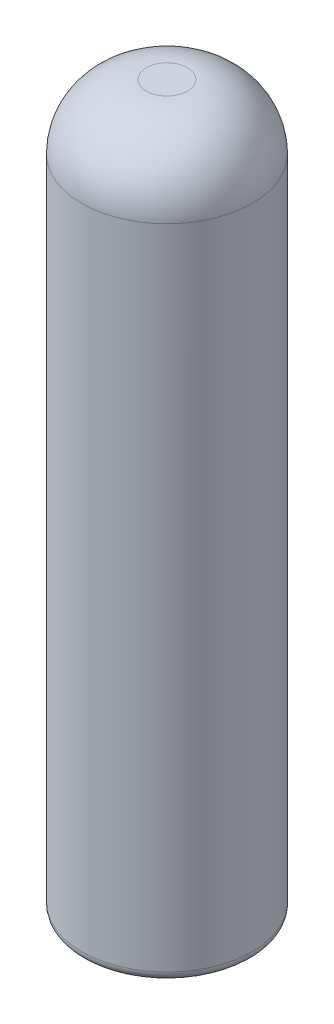
ISO-10303-21;
HEADER;
FILE_DESCRIPTION(('STEP AP214'),'2;1');
FILE_NAME('part.step','',(''),(''),'','','');
FILE_SCHEMA(('AUTOMOTIVE_DESIGN { 1 0 10303 214 1 1 1 1 }'));
ENDSEC;
DATA;
#1=APPLICATION_CONTEXT('core data for automotive mechanical design processes');
#2=APPLICATION_PROTOCOL_DEFINITION('international standard','automotive_design',2000,#1);
#3=PRODUCT_CONTEXT('',#1,'mechanical');
#4=PRODUCT('Part','Part','',(#3));
#5=PRODUCT_RELATED_PRODUCT_CATEGORY('part','',(#4));
#6=PRODUCT_DEFINITION_FORMATION('','',#4);
#7=PRODUCT_DEFINITION_CONTEXT('part definition',#1,'design');
#8=PRODUCT_DEFINITION('design','',#6,#7);
#9=PRODUCT_DEFINITION_SHAPE('','',#8);
#10=(LENGTH_UNIT() NAMED_UNIT(*) SI_UNIT(.MILLI.,.METRE.));
#11=(NAMED_UNIT(*) PLANE_ANGLE_UNIT() SI_UNIT($,.RADIAN.));
#12=(NAMED_UNIT(*) SI_UNIT($,.STERADIAN.) SOLID_ANGLE_UNIT());
#13=UNCERTAINTY_MEASURE_WITH_UNIT(LENGTH_MEASURE(1.E-05),#10,'distance_accuracy_value','');
#14=(GEOMETRIC_REPRESENTATION_CONTEXT(3) GLOBAL_UNCERTAINTY_ASSIGNED_CONTEXT((#13)) GLOBAL_UNIT_ASSIGNED_CONTEXT((#10,
#11,#12)) REPRESENTATION_CONTEXT('',''));
#15=CARTESIAN_POINT('',(0.,0.,0.));
#16=DIRECTION('',(0.,0.,1.));
#17=DIRECTION('',(1.,0.,0.));
#18=AXIS2_PLACEMENT_3D('',#15,#16,#17);
#19=CARTESIAN_POINT('',(0.,0.,0.));
#20=DIRECTION('',(0.,-1.,0.));
#21=DIRECTION('',(0.,0.,-1.));
#22=AXIS2_PLACEMENT_3D('',#19,#20,#21);
#23=PLANE('',#22);
#24=CARTESIAN_POINT('',(0.,0.,0.));
#25=DIRECTION('',(0.,-1.,0.));
#26=DIRECTION('',(0.,0.,-1.));
#27=AXIS2_PLACEMENT_3D('',#24,#25,#26);
#28=CIRCLE('',#27,75.5);
#29=CARTESIAN_POINT('',(0.,0.,-75.5));
#30=VERTEX_POINT('',#29);
#31=EDGE_CURVE('E10',#30,#30,#28,.T.);
#32=ORIENTED_EDGE('',*,*,#31,.T.);
#33=EDGE_LOOP('',(#32));
#34=FACE_BOUND('',#33,.T.);
#35=ADVANCED_FACE('F47',(#34),#23,.T.);
#36=CARTESIAN_POINT('',(0.,0.,0.));
#37=DIRECTION('',(0.,1.,0.));
#38=DIRECTION('',(0.,0.,1.));
#39=AXIS2_PLACEMENT_3D('',#36,#37,#38);
#40=CYLINDRICAL_SURFACE('',#39,85.5);
#41=CARTESIAN_POINT('',(0.,10.,0.));
#42=DIRECTION('',(0.,-1.,0.));
#43=DIRECTION('',(0.,0.,-1.));
#44=AXIS2_PLACEMENT_3D('',#41,#42,#43);
#45=CIRCLE('',#44,85.5);
#46=CARTESIAN_POINT('',(0.,10.,-85.5));
#47=VERTEX_POINT('',#46);
#48=EDGE_CURVE('E55',#47,#47,#45,.F.);
#49=ORIENTED_EDGE('',*,*,#48,.T.);
#50=EDGE_LOOP('',(#49));
#51=FACE_BOUND('',#50,.T.);
#52=CARTESIAN_POINT('',(0.,660.,0.));
#53=DIRECTION('',(0.,1.,0.));
#54=DIRECTION('',(0.,0.,1.));
#55=AXIS2_PLACEMENT_3D('',#52,#53,#54);
#56=CIRCLE('',#55,85.5);
#57=CARTESIAN_POINT('',(0.,660.,85.5));
#58=VERTEX_POINT('',#57);
#59=EDGE_CURVE('E60',#58,#58,#56,.T.);
#60=ORIENTED_EDGE('',*,*,#59,.F.);
#61=EDGE_LOOP('',(#60));
#62=FACE_BOUND('',#61,.T.);
#63=ADVANCED_FACE('F76',(#51,#62),#40,.T.);
#64=CARTESIAN_POINT('',(0.,660.,0.));
#65=DIRECTION('',(0.,1.,0.));
#66=DIRECTION('',(0.,0.,1.));
#67=AXIS2_PLACEMENT_3D('',#64,#65,#66);
#68=DEGENERATE_TOROIDAL_SURFACE('',#67,20.5,65.,.T.);
#69=ORIENTED_EDGE('',*,*,#59,.T.);
#70=EDGE_LOOP('',(#69));
#71=FACE_BOUND('',#70,.T.);
#72=CARTESIAN_POINT('',(0.,725.,0.));
#73=DIRECTION('',(0.,1.,0.));
#74=DIRECTION('',(0.,0.,1.));
#75=AXIS2_PLACEMENT_3D('',#72,#73,#74);
#76=CIRCLE('',#75,20.5);
#77=CARTESIAN_POINT('',(0.,725.,20.5));
#78=VERTEX_POINT('',#77);
#79=EDGE_CURVE('E65',#78,#78,#76,.T.);
#80=ORIENTED_EDGE('',*,*,#79,.F.);
#81=EDGE_LOOP('',(#80));
#82=FACE_BOUND('',#81,.T.);
#83=ADVANCED_FACE('F74',(#71,#82),#68,.T.);
#84=CARTESIAN_POINT('',(-20.5,725.,0.));
#85=DIRECTION('',(0.,1.,0.));
#86=DIRECTION('',(0.,0.,1.));
#87=AXIS2_PLACEMENT_3D('',#84,#85,#86);
#88=PLANE('',#87);
#89=ORIENTED_EDGE('',*,*,#79,.T.);
#90=EDGE_LOOP('',(#89));
#91=FACE_BOUND('',#90,.T.);
#92=ADVANCED_FACE('F72',(#91),#88,.T.);
#93=CARTESIAN_POINT('',(0.,10.,0.));
#94=DIRECTION('',(0.,-1.,0.));
#95=DIRECTION('',(0.,0.,-1.));
#96=AXIS2_PLACEMENT_3D('',#93,#94,#95);
#97=TOROIDAL_SURFACE('',#96,75.5,10.);
#98=ORIENTED_EDGE('',*,*,#31,.F.);
#99=EDGE_LOOP('',(#98));
#100=FACE_BOUND('',#99,.T.);
#101=ORIENTED_EDGE('',*,*,#48,.F.);
#102=EDGE_LOOP('',(#101));
#103=FACE_BOUND('',#102,.T.);
#104=ADVANCED_FACE('F49',(#100,#103),#97,.T.);
#105=CLOSED_SHELL('',(#35,#63,#83,#92,#104));
#106=MANIFOLD_SOLID_BREP('B2',#105);
#107=ADVANCED_BREP_SHAPE_REPRESENTATION('',(#18,#106),#14);
#108=SHAPE_DEFINITION_REPRESENTATION(#9,#107);
ENDSEC;
END-ISO-10303-21;
